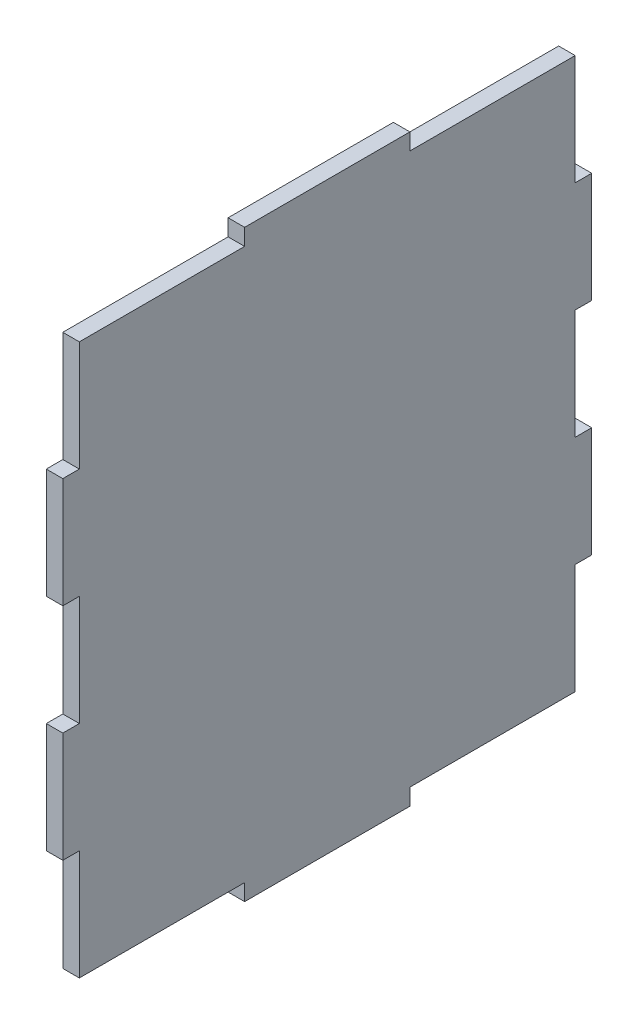
ISO-10303-21;
HEADER;
FILE_DESCRIPTION(('STEP AP214'),'2;1');
FILE_NAME('part.step','',(''),(''),'','','');
FILE_SCHEMA(('AUTOMOTIVE_DESIGN { 1 0 10303 214 1 1 1 1 }'));
ENDSEC;
DATA;
#1=APPLICATION_CONTEXT('core data for automotive mechanical design processes');
#2=APPLICATION_PROTOCOL_DEFINITION('international standard','automotive_design',2000,#1);
#3=PRODUCT_CONTEXT('',#1,'mechanical');
#4=PRODUCT('Part','Part','',(#3));
#5=PRODUCT_RELATED_PRODUCT_CATEGORY('part','',(#4));
#6=PRODUCT_DEFINITION_FORMATION('','',#4);
#7=PRODUCT_DEFINITION_CONTEXT('part definition',#1,'design');
#8=PRODUCT_DEFINITION('design','',#6,#7);
#9=PRODUCT_DEFINITION_SHAPE('','',#8);
#10=(LENGTH_UNIT() NAMED_UNIT(*) SI_UNIT(.MILLI.,.METRE.));
#11=(NAMED_UNIT(*) PLANE_ANGLE_UNIT() SI_UNIT($,.RADIAN.));
#12=(NAMED_UNIT(*) SI_UNIT($,.STERADIAN.) SOLID_ANGLE_UNIT());
#13=UNCERTAINTY_MEASURE_WITH_UNIT(LENGTH_MEASURE(1.E-05),#10,'distance_accuracy_value','');
#14=(GEOMETRIC_REPRESENTATION_CONTEXT(3) GLOBAL_UNCERTAINTY_ASSIGNED_CONTEXT((#13)) GLOBAL_UNIT_ASSIGNED_CONTEXT((#10,
#11,#12)) REPRESENTATION_CONTEXT('',''));
#15=CARTESIAN_POINT('',(0.,0.,0.));
#16=DIRECTION('',(0.,0.,1.));
#17=DIRECTION('',(1.,0.,0.));
#18=AXIS2_PLACEMENT_3D('',#15,#16,#17);
#19=CARTESIAN_POINT('',(3.,51.6037735849056,26.4150943396226));
#20=DIRECTION('',(0.,0.,-1.));
#21=DIRECTION('',(0.,1.,0.));
#22=AXIS2_PLACEMENT_3D('',#19,#20,#21);
#23=PLANE('',#22);
#24=DIRECTION('',(0.,-1.,0.));
#25=VECTOR('',#24,1.);
#26=CARTESIAN_POINT('',(0.,51.6037735849056,26.4150943396226));
#27=LINE('',#26,#25);
#28=CARTESIAN_POINT('',(0.,51.6037735849056,26.4150943396226));
#29=VERTEX_POINT('',#28);
#30=CARTESIAN_POINT('',(0.,31.6037735849056,26.4150943396228));
#31=VERTEX_POINT('',#30);
#32=EDGE_CURVE('E249',#29,#31,#27,.T.);
#33=ORIENTED_EDGE('',*,*,#32,.T.);
#34=DIRECTION('',(-1.,0.,0.));
#35=VECTOR('',#34,1.);
#36=CARTESIAN_POINT('',(3.,31.6037735849056,26.4150943396228));
#37=LINE('',#36,#35);
#38=CARTESIAN_POINT('',(3.,31.6037735849056,26.4150943396228));
#39=VERTEX_POINT('',#38);
#40=EDGE_CURVE('E11',#39,#31,#37,.T.);
#41=ORIENTED_EDGE('',*,*,#40,.F.);
#42=DIRECTION('',(0.,-1.,0.));
#43=VECTOR('',#42,1.);
#44=CARTESIAN_POINT('',(3.,51.6037735849056,26.4150943396226));
#45=LINE('',#44,#43);
#46=CARTESIAN_POINT('',(3.,51.6037735849056,26.4150943396226));
#47=VERTEX_POINT('',#46);
#48=EDGE_CURVE('E303',#47,#39,#45,.T.);
#49=ORIENTED_EDGE('',*,*,#48,.F.);
#50=DIRECTION('',(-1.,0.,0.));
#51=VECTOR('',#50,1.);
#52=CARTESIAN_POINT('',(3.,51.6037735849056,26.4150943396226));
#53=LINE('',#52,#51);
#54=EDGE_CURVE('E245',#47,#29,#53,.T.);
#55=ORIENTED_EDGE('',*,*,#54,.T.);
#56=EDGE_LOOP('',(#33,#41,#49,#55));
#57=FACE_BOUND('',#56,.T.);
#58=ADVANCED_FACE('F33',(#57),#23,.F.);
#59=CARTESIAN_POINT('',(3.,31.6037735849056,26.4150943396228));
#60=DIRECTION('',(0.,-1.,0.));
#61=DIRECTION('',(0.,0.,-1.));
#62=AXIS2_PLACEMENT_3D('',#59,#60,#61);
#63=PLANE('',#62);
#64=DIRECTION('',(0.,0.,1.));
#65=VECTOR('',#64,1.);
#66=CARTESIAN_POINT('',(0.,31.6037735849056,26.4150943396228));
#67=LINE('',#66,#65);
#68=CARTESIAN_POINT('',(0.,31.6037735849056,29.4150943396228));
#69=VERTEX_POINT('',#68);
#70=EDGE_CURVE('E252',#31,#69,#67,.T.);
#71=ORIENTED_EDGE('',*,*,#70,.T.);
#72=DIRECTION('',(-1.,0.,0.));
#73=VECTOR('',#72,1.);
#74=CARTESIAN_POINT('',(3.,31.6037735849056,29.4150943396228));
#75=LINE('',#74,#73);
#76=CARTESIAN_POINT('',(3.,31.6037735849056,29.4150943396228));
#77=VERTEX_POINT('',#76);
#78=EDGE_CURVE('E41',#77,#69,#75,.T.);
#79=ORIENTED_EDGE('',*,*,#78,.F.);
#80=DIRECTION('',(0.,0.,1.));
#81=VECTOR('',#80,1.);
#82=CARTESIAN_POINT('',(3.,31.6037735849056,26.4150943396228));
#83=LINE('',#82,#81);
#84=EDGE_CURVE('E152',#39,#77,#83,.T.);
#85=ORIENTED_EDGE('',*,*,#84,.F.);
#86=ORIENTED_EDGE('',*,*,#40,.T.);
#87=EDGE_LOOP('',(#71,#79,#85,#86));
#88=FACE_BOUND('',#87,.T.);
#89=ADVANCED_FACE('F461',(#88),#63,.F.);
#90=CARTESIAN_POINT('',(3.,11.6037735849056,29.4150943396228));
#91=DIRECTION('',(0.,0.,-1.));
#92=DIRECTION('',(0.,1.,0.));
#93=AXIS2_PLACEMENT_3D('',#90,#91,#92);
#94=PLANE('',#93);
#95=DIRECTION('',(0.,-1.,0.));
#96=VECTOR('',#95,1.);
#97=CARTESIAN_POINT('',(0.,11.6037735849056,29.4150943396228));
#98=LINE('',#97,#96);
#99=CARTESIAN_POINT('',(0.,11.6037735849056,29.4150943396228));
#100=VERTEX_POINT('',#99);
#101=EDGE_CURVE('E254',#69,#100,#98,.T.);
#102=ORIENTED_EDGE('',*,*,#101,.T.);
#103=DIRECTION('',(-1.,0.,0.));
#104=VECTOR('',#103,1.);
#105=CARTESIAN_POINT('',(3.,11.6037735849056,29.4150943396228));
#106=LINE('',#105,#104);
#107=CARTESIAN_POINT('',(3.,11.6037735849056,29.4150943396228));
#108=VERTEX_POINT('',#107);
#109=EDGE_CURVE('E370',#108,#100,#106,.T.);
#110=ORIENTED_EDGE('',*,*,#109,.F.);
#111=DIRECTION('',(0.,-1.,0.));
#112=VECTOR('',#111,1.);
#113=CARTESIAN_POINT('',(3.,11.6037735849056,29.4150943396228));
#114=LINE('',#113,#112);
#115=EDGE_CURVE('E378',#77,#108,#114,.T.);
#116=ORIENTED_EDGE('',*,*,#115,.F.);
#117=ORIENTED_EDGE('',*,*,#78,.T.);
#118=EDGE_LOOP('',(#102,#110,#116,#117));
#119=FACE_BOUND('',#118,.T.);
#120=ADVANCED_FACE('F376',(#119),#94,.F.);
#121=CARTESIAN_POINT('',(3.,11.6037735849056,26.4150943396228));
#122=DIRECTION('',(0.,1.,0.));
#123=DIRECTION('',(0.,0.,1.));
#124=AXIS2_PLACEMENT_3D('',#121,#122,#123);
#125=PLANE('',#124);
#126=DIRECTION('',(0.,0.,-1.));
#127=VECTOR('',#126,1.);
#128=CARTESIAN_POINT('',(0.,11.6037735849056,26.4150943396228));
#129=LINE('',#128,#127);
#130=CARTESIAN_POINT('',(0.,11.6037735849056,26.4150943396228));
#131=VERTEX_POINT('',#130);
#132=EDGE_CURVE('E256',#100,#131,#129,.T.);
#133=ORIENTED_EDGE('',*,*,#132,.T.);
#134=DIRECTION('',(-1.,0.,0.));
#135=VECTOR('',#134,1.);
#136=CARTESIAN_POINT('',(3.,11.6037735849056,26.4150943396228));
#137=LINE('',#136,#135);
#138=CARTESIAN_POINT('',(3.,11.6037735849056,26.4150943396228));
#139=VERTEX_POINT('',#138);
#140=EDGE_CURVE('E367',#139,#131,#137,.T.);
#141=ORIENTED_EDGE('',*,*,#140,.F.);
#142=DIRECTION('',(0.,0.,-1.));
#143=VECTOR('',#142,1.);
#144=CARTESIAN_POINT('',(3.,11.6037735849056,26.4150943396228));
#145=LINE('',#144,#143);
#146=EDGE_CURVE('E396',#108,#139,#145,.T.);
#147=ORIENTED_EDGE('',*,*,#146,.F.);
#148=ORIENTED_EDGE('',*,*,#109,.T.);
#149=EDGE_LOOP('',(#133,#141,#147,#148));
#150=FACE_BOUND('',#149,.T.);
#151=ADVANCED_FACE('F387',(#150),#125,.F.);
#152=CARTESIAN_POINT('',(3.,11.6037735849056,26.4150943396228));
#153=DIRECTION('',(0.,0.,-1.));
#154=DIRECTION('',(0.,1.,0.));
#155=AXIS2_PLACEMENT_3D('',#152,#153,#154);
#156=PLANE('',#155);
#157=DIRECTION('',(0.,-1.,0.));
#158=VECTOR('',#157,1.);
#159=CARTESIAN_POINT('',(0.,11.6037735849056,26.4150943396228));
#160=LINE('',#159,#158);
#161=CARTESIAN_POINT('',(0.,-8.39622641509436,26.4150943396226));
#162=VERTEX_POINT('',#161);
#163=EDGE_CURVE('E258',#131,#162,#160,.T.);
#164=ORIENTED_EDGE('',*,*,#163,.T.);
#165=DIRECTION('',(-1.,0.,0.));
#166=VECTOR('',#165,1.);
#167=CARTESIAN_POINT('',(3.,-8.39622641509436,26.4150943396226));
#168=LINE('',#167,#166);
#169=CARTESIAN_POINT('',(3.,-8.39622641509436,26.4150943396226));
#170=VERTEX_POINT('',#169);
#171=EDGE_CURVE('E364',#170,#162,#168,.T.);
#172=ORIENTED_EDGE('',*,*,#171,.F.);
#173=DIRECTION('',(0.,-1.,0.));
#174=VECTOR('',#173,1.);
#175=CARTESIAN_POINT('',(3.,11.6037735849056,26.4150943396228));
#176=LINE('',#175,#174);
#177=EDGE_CURVE('E393',#139,#170,#176,.T.);
#178=ORIENTED_EDGE('',*,*,#177,.F.);
#179=ORIENTED_EDGE('',*,*,#140,.T.);
#180=EDGE_LOOP('',(#164,#172,#178,#179));
#181=FACE_BOUND('',#180,.T.);
#182=ADVANCED_FACE('F391',(#181),#156,.F.);
#183=CARTESIAN_POINT('',(3.,-8.39622641509436,26.4150943396226));
#184=DIRECTION('',(0.,-1.,0.));
#185=DIRECTION('',(0.,0.,-1.));
#186=AXIS2_PLACEMENT_3D('',#183,#184,#185);
#187=PLANE('',#186);
#188=DIRECTION('',(0.,0.,1.));
#189=VECTOR('',#188,1.);
#190=CARTESIAN_POINT('',(0.,-8.39622641509436,26.4150943396226));
#191=LINE('',#190,#189);
#192=CARTESIAN_POINT('',(0.,-8.39622641509436,29.4150943396226));
#193=VERTEX_POINT('',#192);
#194=EDGE_CURVE('E260',#162,#193,#191,.T.);
#195=ORIENTED_EDGE('',*,*,#194,.T.);
#196=DIRECTION('',(-1.,0.,0.));
#197=VECTOR('',#196,1.);
#198=CARTESIAN_POINT('',(3.,-8.39622641509436,29.4150943396226));
#199=LINE('',#198,#197);
#200=CARTESIAN_POINT('',(3.,-8.39622641509436,29.4150943396226));
#201=VERTEX_POINT('',#200);
#202=EDGE_CURVE('E361',#201,#193,#199,.T.);
#203=ORIENTED_EDGE('',*,*,#202,.F.);
#204=DIRECTION('',(0.,0.,1.));
#205=VECTOR('',#204,1.);
#206=CARTESIAN_POINT('',(3.,-8.39622641509436,26.4150943396226));
#207=LINE('',#206,#205);
#208=EDGE_CURVE('E395',#170,#201,#207,.T.);
#209=ORIENTED_EDGE('',*,*,#208,.F.);
#210=ORIENTED_EDGE('',*,*,#171,.T.);
#211=EDGE_LOOP('',(#195,#203,#209,#210));
#212=FACE_BOUND('',#211,.T.);
#213=ADVANCED_FACE('F474',(#212),#187,.F.);
#214=CARTESIAN_POINT('',(3.,-28.3962264150944,29.4150943396226));
#215=DIRECTION('',(0.,0.,-1.));
#216=DIRECTION('',(0.,1.,0.));
#217=AXIS2_PLACEMENT_3D('',#214,#215,#216);
#218=PLANE('',#217);
#219=DIRECTION('',(0.,-1.,0.));
#220=VECTOR('',#219,1.);
#221=CARTESIAN_POINT('',(0.,-28.3962264150944,29.4150943396226));
#222=LINE('',#221,#220);
#223=CARTESIAN_POINT('',(0.,-28.3962264150944,29.4150943396226));
#224=VERTEX_POINT('',#223);
#225=EDGE_CURVE('E262',#193,#224,#222,.T.);
#226=ORIENTED_EDGE('',*,*,#225,.T.);
#227=DIRECTION('',(-1.,0.,0.));
#228=VECTOR('',#227,1.);
#229=CARTESIAN_POINT('',(3.,-28.3962264150944,29.4150943396226));
#230=LINE('',#229,#228);
#231=CARTESIAN_POINT('',(3.,-28.3962264150944,29.4150943396226));
#232=VERTEX_POINT('',#231);
#233=EDGE_CURVE('E358',#232,#224,#230,.T.);
#234=ORIENTED_EDGE('',*,*,#233,.F.);
#235=DIRECTION('',(0.,-1.,0.));
#236=VECTOR('',#235,1.);
#237=CARTESIAN_POINT('',(3.,-28.3962264150944,29.4150943396226));
#238=LINE('',#237,#236);
#239=EDGE_CURVE('E398',#201,#232,#238,.T.);
#240=ORIENTED_EDGE('',*,*,#239,.F.);
#241=ORIENTED_EDGE('',*,*,#202,.T.);
#242=EDGE_LOOP('',(#226,#234,#240,#241));
#243=FACE_BOUND('',#242,.T.);
#244=ADVANCED_FACE('F477',(#243),#218,.F.);
#245=CARTESIAN_POINT('',(3.,-28.3962264150944,26.4150943396226));
#246=DIRECTION('',(0.,1.,0.));
#247=DIRECTION('',(0.,0.,1.));
#248=AXIS2_PLACEMENT_3D('',#245,#246,#247);
#249=PLANE('',#248);
#250=DIRECTION('',(0.,0.,-1.));
#251=VECTOR('',#250,1.);
#252=CARTESIAN_POINT('',(0.,-28.3962264150944,26.4150943396226));
#253=LINE('',#252,#251);
#254=CARTESIAN_POINT('',(0.,-28.3962264150944,26.4150943396226));
#255=VERTEX_POINT('',#254);
#256=EDGE_CURVE('E264',#224,#255,#253,.T.);
#257=ORIENTED_EDGE('',*,*,#256,.T.);
#258=DIRECTION('',(-1.,0.,0.));
#259=VECTOR('',#258,1.);
#260=CARTESIAN_POINT('',(3.,-28.3962264150944,26.4150943396226));
#261=LINE('',#260,#259);
#262=CARTESIAN_POINT('',(3.,-28.3962264150944,26.4150943396226));
#263=VERTEX_POINT('',#262);
#264=EDGE_CURVE('E355',#263,#255,#261,.T.);
#265=ORIENTED_EDGE('',*,*,#264,.F.);
#266=DIRECTION('',(0.,0.,-1.));
#267=VECTOR('',#266,1.);
#268=CARTESIAN_POINT('',(3.,-28.3962264150944,26.4150943396226));
#269=LINE('',#268,#267);
#270=EDGE_CURVE('E404',#232,#263,#269,.T.);
#271=ORIENTED_EDGE('',*,*,#270,.F.);
#272=ORIENTED_EDGE('',*,*,#233,.T.);
#273=EDGE_LOOP('',(#257,#265,#271,#272));
#274=FACE_BOUND('',#273,.T.);
#275=ADVANCED_FACE('F481',(#274),#249,.F.);
#276=CARTESIAN_POINT('',(3.,-28.3962264150944,26.4150943396226));
#277=DIRECTION('',(0.,0.,-1.));
#278=DIRECTION('',(0.,1.,0.));
#279=AXIS2_PLACEMENT_3D('',#276,#277,#278);
#280=PLANE('',#279);
#281=DIRECTION('',(0.,-1.,0.));
#282=VECTOR('',#281,1.);
#283=CARTESIAN_POINT('',(0.,-28.3962264150944,26.4150943396226));
#284=LINE('',#283,#282);
#285=CARTESIAN_POINT('',(0.,-48.3962264150944,26.4150943396226));
#286=VERTEX_POINT('',#285);
#287=EDGE_CURVE('E266',#255,#286,#284,.T.);
#288=ORIENTED_EDGE('',*,*,#287,.T.);
#289=DIRECTION('',(-1.,0.,0.));
#290=VECTOR('',#289,1.);
#291=CARTESIAN_POINT('',(3.,-48.3962264150944,26.4150943396226));
#292=LINE('',#291,#290);
#293=CARTESIAN_POINT('',(3.,-48.3962264150944,26.4150943396226));
#294=VERTEX_POINT('',#293);
#295=EDGE_CURVE('E352',#294,#286,#292,.T.);
#296=ORIENTED_EDGE('',*,*,#295,.F.);
#297=DIRECTION('',(0.,-1.,0.));
#298=VECTOR('',#297,1.);
#299=CARTESIAN_POINT('',(3.,-28.3962264150944,26.4150943396226));
#300=LINE('',#299,#298);
#301=EDGE_CURVE('E406',#263,#294,#300,.T.);
#302=ORIENTED_EDGE('',*,*,#301,.F.);
#303=ORIENTED_EDGE('',*,*,#264,.T.);
#304=EDGE_LOOP('',(#288,#296,#302,#303));
#305=FACE_BOUND('',#304,.T.);
#306=ADVANCED_FACE('F485',(#305),#280,.F.);
#307=CARTESIAN_POINT('',(3.,-48.3962264150944,26.4150943396226));
#308=DIRECTION('',(0.,1.,0.));
#309=DIRECTION('',(0.,0.,1.));
#310=AXIS2_PLACEMENT_3D('',#307,#308,#309);
#311=PLANE('',#310);
#312=DIRECTION('',(0.,0.,-1.));
#313=VECTOR('',#312,1.);
#314=CARTESIAN_POINT('',(0.,-48.3962264150944,26.4150943396226));
#315=LINE('',#314,#313);
#316=CARTESIAN_POINT('',(0.,-48.3962264150944,-3.58490566037735));
#317=VERTEX_POINT('',#316);
#318=EDGE_CURVE('E268',#286,#317,#315,.T.);
#319=ORIENTED_EDGE('',*,*,#318,.T.);
#320=DIRECTION('',(-1.,0.,0.));
#321=VECTOR('',#320,1.);
#322=CARTESIAN_POINT('',(3.,-48.3962264150944,-3.58490566037735));
#323=LINE('',#322,#321);
#324=CARTESIAN_POINT('',(3.,-48.3962264150944,-3.58490566037735));
#325=VERTEX_POINT('',#324);
#326=EDGE_CURVE('E349',#325,#317,#323,.T.);
#327=ORIENTED_EDGE('',*,*,#326,.F.);
#328=DIRECTION('',(0.,0.,-1.));
#329=VECTOR('',#328,1.);
#330=CARTESIAN_POINT('',(3.,-48.3962264150944,26.4150943396226));
#331=LINE('',#330,#329);
#332=EDGE_CURVE('E408',#294,#325,#331,.T.);
#333=ORIENTED_EDGE('',*,*,#332,.F.);
#334=ORIENTED_EDGE('',*,*,#295,.T.);
#335=EDGE_LOOP('',(#319,#327,#333,#334));
#336=FACE_BOUND('',#335,.T.);
#337=ADVANCED_FACE('F489',(#336),#311,.F.);
#338=CARTESIAN_POINT('',(3.,-48.3962264150944,-3.58490566037735));
#339=DIRECTION('',(0.,0.,-1.));
#340=DIRECTION('',(0.,1.,0.));
#341=AXIS2_PLACEMENT_3D('',#338,#339,#340);
#342=PLANE('',#341);
#343=DIRECTION('',(0.,-1.,0.));
#344=VECTOR('',#343,1.);
#345=CARTESIAN_POINT('',(0.,-48.3962264150944,-3.58490566037735));
#346=LINE('',#345,#344);
#347=CARTESIAN_POINT('',(0.,-51.3962264150944,-3.58490566037735));
#348=VERTEX_POINT('',#347);
#349=EDGE_CURVE('E270',#317,#348,#346,.T.);
#350=ORIENTED_EDGE('',*,*,#349,.T.);
#351=DIRECTION('',(-1.,0.,0.));
#352=VECTOR('',#351,1.);
#353=CARTESIAN_POINT('',(3.,-51.3962264150944,-3.58490566037735));
#354=LINE('',#353,#352);
#355=CARTESIAN_POINT('',(3.,-51.3962264150944,-3.58490566037735));
#356=VERTEX_POINT('',#355);
#357=EDGE_CURVE('E346',#356,#348,#354,.T.);
#358=ORIENTED_EDGE('',*,*,#357,.F.);
#359=DIRECTION('',(0.,-1.,0.));
#360=VECTOR('',#359,1.);
#361=CARTESIAN_POINT('',(3.,-48.3962264150944,-3.58490566037735));
#362=LINE('',#361,#360);
#363=EDGE_CURVE('E410',#325,#356,#362,.T.);
#364=ORIENTED_EDGE('',*,*,#363,.F.);
#365=ORIENTED_EDGE('',*,*,#326,.T.);
#366=EDGE_LOOP('',(#350,#358,#364,#365));
#367=FACE_BOUND('',#366,.T.);
#368=ADVANCED_FACE('F493',(#367),#342,.F.);
#369=CARTESIAN_POINT('',(3.,-51.3962264150944,-33.5849056603773));
#370=DIRECTION('',(0.,1.,0.));
#371=DIRECTION('',(0.,0.,1.));
#372=AXIS2_PLACEMENT_3D('',#369,#370,#371);
#373=PLANE('',#372);
#374=DIRECTION('',(0.,0.,-1.));
#375=VECTOR('',#374,1.);
#376=CARTESIAN_POINT('',(0.,-51.3962264150944,-33.5849056603773));
#377=LINE('',#376,#375);
#378=CARTESIAN_POINT('',(0.,-51.3962264150944,-33.5849056603773));
#379=VERTEX_POINT('',#378);
#380=EDGE_CURVE('E272',#348,#379,#377,.T.);
#381=ORIENTED_EDGE('',*,*,#380,.T.);
#382=DIRECTION('',(-1.,0.,0.));
#383=VECTOR('',#382,1.);
#384=CARTESIAN_POINT('',(3.,-51.3962264150944,-33.5849056603773));
#385=LINE('',#384,#383);
#386=CARTESIAN_POINT('',(3.,-51.3962264150944,-33.5849056603773));
#387=VERTEX_POINT('',#386);
#388=EDGE_CURVE('E343',#387,#379,#385,.T.);
#389=ORIENTED_EDGE('',*,*,#388,.F.);
#390=DIRECTION('',(0.,0.,-1.));
#391=VECTOR('',#390,1.);
#392=CARTESIAN_POINT('',(3.,-51.3962264150944,-33.5849056603773));
#393=LINE('',#392,#391);
#394=EDGE_CURVE('E412',#356,#387,#393,.T.);
#395=ORIENTED_EDGE('',*,*,#394,.F.);
#396=ORIENTED_EDGE('',*,*,#357,.T.);
#397=EDGE_LOOP('',(#381,#389,#395,#396));
#398=FACE_BOUND('',#397,.T.);
#399=ADVANCED_FACE('F497',(#398),#373,.F.);
#400=CARTESIAN_POINT('',(3.,-48.3962264150944,-33.5849056603773));
#401=DIRECTION('',(0.,0.,1.));
#402=DIRECTION('',(1.,0.,0.));
#403=AXIS2_PLACEMENT_3D('',#400,#401,#402);
#404=PLANE('',#403);
#405=DIRECTION('',(0.,1.,0.));
#406=VECTOR('',#405,1.);
#407=CARTESIAN_POINT('',(0.,-48.3962264150944,-33.5849056603773));
#408=LINE('',#407,#406);
#409=CARTESIAN_POINT('',(0.,-48.3962264150944,-33.5849056603773));
#410=VERTEX_POINT('',#409);
#411=EDGE_CURVE('E274',#379,#410,#408,.T.);
#412=ORIENTED_EDGE('',*,*,#411,.T.);
#413=DIRECTION('',(-1.,0.,0.));
#414=VECTOR('',#413,1.);
#415=CARTESIAN_POINT('',(3.,-48.3962264150944,-33.5849056603773));
#416=LINE('',#415,#414);
#417=CARTESIAN_POINT('',(3.,-48.3962264150944,-33.5849056603773));
#418=VERTEX_POINT('',#417);
#419=EDGE_CURVE('E340',#418,#410,#416,.T.);
#420=ORIENTED_EDGE('',*,*,#419,.F.);
#421=DIRECTION('',(0.,1.,0.));
#422=VECTOR('',#421,1.);
#423=CARTESIAN_POINT('',(3.,-48.3962264150944,-33.5849056603773));
#424=LINE('',#423,#422);
#425=EDGE_CURVE('E414',#387,#418,#424,.T.);
#426=ORIENTED_EDGE('',*,*,#425,.F.);
#427=ORIENTED_EDGE('',*,*,#388,.T.);
#428=EDGE_LOOP('',(#412,#420,#426,#427));
#429=FACE_BOUND('',#428,.T.);
#430=ADVANCED_FACE('F501',(#429),#404,.F.);
#431=CARTESIAN_POINT('',(3.,-48.3962264150944,-33.5849056603773));
#432=DIRECTION('',(0.,1.,0.));
#433=DIRECTION('',(0.,0.,1.));
#434=AXIS2_PLACEMENT_3D('',#431,#432,#433);
#435=PLANE('',#434);
#436=DIRECTION('',(0.,0.,-1.));
#437=VECTOR('',#436,1.);
#438=CARTESIAN_POINT('',(0.,-48.3962264150944,-33.5849056603773));
#439=LINE('',#438,#437);
#440=CARTESIAN_POINT('',(0.,-48.3962264150944,-63.5849056603773));
#441=VERTEX_POINT('',#440);
#442=EDGE_CURVE('E276',#410,#441,#439,.T.);
#443=ORIENTED_EDGE('',*,*,#442,.T.);
#444=DIRECTION('',(-1.,0.,0.));
#445=VECTOR('',#444,1.);
#446=CARTESIAN_POINT('',(3.,-48.3962264150944,-63.5849056603773));
#447=LINE('',#446,#445);
#448=CARTESIAN_POINT('',(3.,-48.3962264150944,-63.5849056603773));
#449=VERTEX_POINT('',#448);
#450=EDGE_CURVE('E337',#449,#441,#447,.T.);
#451=ORIENTED_EDGE('',*,*,#450,.F.);
#452=DIRECTION('',(0.,0.,-1.));
#453=VECTOR('',#452,1.);
#454=CARTESIAN_POINT('',(3.,-48.3962264150944,-33.5849056603773));
#455=LINE('',#454,#453);
#456=EDGE_CURVE('E416',#418,#449,#455,.T.);
#457=ORIENTED_EDGE('',*,*,#456,.F.);
#458=ORIENTED_EDGE('',*,*,#419,.T.);
#459=EDGE_LOOP('',(#443,#451,#457,#458));
#460=FACE_BOUND('',#459,.T.);
#461=ADVANCED_FACE('F505',(#460),#435,.F.);
#462=CARTESIAN_POINT('',(3.,-28.3962264150944,-63.5849056603778));
#463=DIRECTION('',(0.,0.,1.));
#464=DIRECTION('',(0.,-1.,0.));
#465=AXIS2_PLACEMENT_3D('',#462,#463,#464);
#466=PLANE('',#465);
#467=DIRECTION('',(0.,1.,0.));
#468=VECTOR('',#467,1.);
#469=CARTESIAN_POINT('',(0.,-28.3962264150944,-63.5849056603778));
#470=LINE('',#469,#468);
#471=CARTESIAN_POINT('',(0.,-28.3962264150944,-63.5849056603778));
#472=VERTEX_POINT('',#471);
#473=EDGE_CURVE('E278',#441,#472,#470,.T.);
#474=ORIENTED_EDGE('',*,*,#473,.T.);
#475=DIRECTION('',(-1.,0.,0.));
#476=VECTOR('',#475,1.);
#477=CARTESIAN_POINT('',(3.,-28.3962264150944,-63.5849056603778));
#478=LINE('',#477,#476);
#479=CARTESIAN_POINT('',(3.,-28.3962264150944,-63.5849056603778));
#480=VERTEX_POINT('',#479);
#481=EDGE_CURVE('E334',#480,#472,#478,.T.);
#482=ORIENTED_EDGE('',*,*,#481,.F.);
#483=DIRECTION('',(0.,1.,0.));
#484=VECTOR('',#483,1.);
#485=CARTESIAN_POINT('',(3.,-28.3962264150944,-63.5849056603778));
#486=LINE('',#485,#484);
#487=EDGE_CURVE('E418',#449,#480,#486,.T.);
#488=ORIENTED_EDGE('',*,*,#487,.F.);
#489=ORIENTED_EDGE('',*,*,#450,.T.);
#490=EDGE_LOOP('',(#474,#482,#488,#489));
#491=FACE_BOUND('',#490,.T.);
#492=ADVANCED_FACE('F509',(#491),#466,.F.);
#493=CARTESIAN_POINT('',(3.,-28.3962264150944,-63.5849056603778));
#494=DIRECTION('',(0.,1.,0.));
#495=DIRECTION('',(0.,0.,1.));
#496=AXIS2_PLACEMENT_3D('',#493,#494,#495);
#497=PLANE('',#496);
#498=DIRECTION('',(0.,0.,-1.));
#499=VECTOR('',#498,1.);
#500=CARTESIAN_POINT('',(0.,-28.3962264150944,-63.5849056603778));
#501=LINE('',#500,#499);
#502=CARTESIAN_POINT('',(0.,-28.3962264150944,-66.5849056603778));
#503=VERTEX_POINT('',#502);
#504=EDGE_CURVE('E280',#472,#503,#501,.T.);
#505=ORIENTED_EDGE('',*,*,#504,.T.);
#506=DIRECTION('',(-1.,0.,0.));
#507=VECTOR('',#506,1.);
#508=CARTESIAN_POINT('',(3.,-28.3962264150944,-66.5849056603778));
#509=LINE('',#508,#507);
#510=CARTESIAN_POINT('',(3.,-28.3962264150944,-66.5849056603778));
#511=VERTEX_POINT('',#510);
#512=EDGE_CURVE('E331',#511,#503,#509,.T.);
#513=ORIENTED_EDGE('',*,*,#512,.F.);
#514=DIRECTION('',(0.,0.,-1.));
#515=VECTOR('',#514,1.);
#516=CARTESIAN_POINT('',(3.,-28.3962264150944,-63.5849056603778));
#517=LINE('',#516,#515);
#518=EDGE_CURVE('E420',#480,#511,#517,.T.);
#519=ORIENTED_EDGE('',*,*,#518,.F.);
#520=ORIENTED_EDGE('',*,*,#481,.T.);
#521=EDGE_LOOP('',(#505,#513,#519,#520));
#522=FACE_BOUND('',#521,.T.);
#523=ADVANCED_FACE('F513',(#522),#497,.F.);
#524=CARTESIAN_POINT('',(3.,-8.39622641509436,-66.5849056603778));
#525=DIRECTION('',(0.,0.,1.));
#526=DIRECTION('',(1.,0.,0.));
#527=AXIS2_PLACEMENT_3D('',#524,#525,#526);
#528=PLANE('',#527);
#529=DIRECTION('',(0.,1.,0.));
#530=VECTOR('',#529,1.);
#531=CARTESIAN_POINT('',(0.,-8.39622641509436,-66.5849056603778));
#532=LINE('',#531,#530);
#533=CARTESIAN_POINT('',(0.,-8.39622641509436,-66.5849056603778));
#534=VERTEX_POINT('',#533);
#535=EDGE_CURVE('E282',#503,#534,#532,.T.);
#536=ORIENTED_EDGE('',*,*,#535,.T.);
#537=DIRECTION('',(-1.,0.,0.));
#538=VECTOR('',#537,1.);
#539=CARTESIAN_POINT('',(3.,-8.39622641509436,-66.5849056603778));
#540=LINE('',#539,#538);
#541=CARTESIAN_POINT('',(3.,-8.39622641509436,-66.5849056603778));
#542=VERTEX_POINT('',#541);
#543=EDGE_CURVE('E328',#542,#534,#540,.T.);
#544=ORIENTED_EDGE('',*,*,#543,.F.);
#545=DIRECTION('',(0.,1.,0.));
#546=VECTOR('',#545,1.);
#547=CARTESIAN_POINT('',(3.,-8.39622641509436,-66.5849056603778));
#548=LINE('',#547,#546);
#549=EDGE_CURVE('E422',#511,#542,#548,.T.);
#550=ORIENTED_EDGE('',*,*,#549,.F.);
#551=ORIENTED_EDGE('',*,*,#512,.T.);
#552=EDGE_LOOP('',(#536,#544,#550,#551));
#553=FACE_BOUND('',#552,.T.);
#554=ADVANCED_FACE('F517',(#553),#528,.F.);
#555=CARTESIAN_POINT('',(3.,-8.39622641509436,-63.5849056603778));
#556=DIRECTION('',(0.,-1.,0.));
#557=DIRECTION('',(0.,0.,-1.));
#558=AXIS2_PLACEMENT_3D('',#555,#556,#557);
#559=PLANE('',#558);
#560=DIRECTION('',(0.,0.,1.));
#561=VECTOR('',#560,1.);
#562=CARTESIAN_POINT('',(0.,-8.39622641509436,-63.5849056603778));
#563=LINE('',#562,#561);
#564=CARTESIAN_POINT('',(0.,-8.39622641509436,-63.5849056603778));
#565=VERTEX_POINT('',#564);
#566=EDGE_CURVE('E284',#534,#565,#563,.T.);
#567=ORIENTED_EDGE('',*,*,#566,.T.);
#568=DIRECTION('',(-1.,0.,0.));
#569=VECTOR('',#568,1.);
#570=CARTESIAN_POINT('',(3.,-8.39622641509436,-63.5849056603778));
#571=LINE('',#570,#569);
#572=CARTESIAN_POINT('',(3.,-8.39622641509436,-63.5849056603778));
#573=VERTEX_POINT('',#572);
#574=EDGE_CURVE('E325',#573,#565,#571,.T.);
#575=ORIENTED_EDGE('',*,*,#574,.F.);
#576=DIRECTION('',(0.,0.,1.));
#577=VECTOR('',#576,1.);
#578=CARTESIAN_POINT('',(3.,-8.39622641509436,-63.5849056603778));
#579=LINE('',#578,#577);
#580=EDGE_CURVE('E424',#542,#573,#579,.T.);
#581=ORIENTED_EDGE('',*,*,#580,.F.);
#582=ORIENTED_EDGE('',*,*,#543,.T.);
#583=EDGE_LOOP('',(#567,#575,#581,#582));
#584=FACE_BOUND('',#583,.T.);
#585=ADVANCED_FACE('F521',(#584),#559,.F.);
#586=CARTESIAN_POINT('',(3.,11.6037735849056,-63.5849056603773));
#587=DIRECTION('',(0.,0.,1.));
#588=DIRECTION('',(0.,-1.,0.));
#589=AXIS2_PLACEMENT_3D('',#586,#587,#588);
#590=PLANE('',#589);
#591=DIRECTION('',(0.,1.,0.));
#592=VECTOR('',#591,1.);
#593=CARTESIAN_POINT('',(0.,11.6037735849056,-63.5849056603773));
#594=LINE('',#593,#592);
#595=CARTESIAN_POINT('',(0.,11.6037735849056,-63.5849056603773));
#596=VERTEX_POINT('',#595);
#597=EDGE_CURVE('E286',#565,#596,#594,.T.);
#598=ORIENTED_EDGE('',*,*,#597,.T.);
#599=DIRECTION('',(-1.,0.,0.));
#600=VECTOR('',#599,1.);
#601=CARTESIAN_POINT('',(3.,11.6037735849056,-63.5849056603773));
#602=LINE('',#601,#600);
#603=CARTESIAN_POINT('',(3.,11.6037735849056,-63.5849056603773));
#604=VERTEX_POINT('',#603);
#605=EDGE_CURVE('E322',#604,#596,#602,.T.);
#606=ORIENTED_EDGE('',*,*,#605,.F.);
#607=DIRECTION('',(0.,1.,0.));
#608=VECTOR('',#607,1.);
#609=CARTESIAN_POINT('',(3.,11.6037735849056,-63.5849056603773));
#610=LINE('',#609,#608);
#611=EDGE_CURVE('E426',#573,#604,#610,.T.);
#612=ORIENTED_EDGE('',*,*,#611,.F.);
#613=ORIENTED_EDGE('',*,*,#574,.T.);
#614=EDGE_LOOP('',(#598,#606,#612,#613));
#615=FACE_BOUND('',#614,.T.);
#616=ADVANCED_FACE('F525',(#615),#590,.F.);
#617=CARTESIAN_POINT('',(3.,11.6037735849056,-63.5849056603773));
#618=DIRECTION('',(0.,1.,0.));
#619=DIRECTION('',(0.,0.,1.));
#620=AXIS2_PLACEMENT_3D('',#617,#618,#619);
#621=PLANE('',#620);
#622=DIRECTION('',(0.,0.,-1.));
#623=VECTOR('',#622,1.);
#624=CARTESIAN_POINT('',(0.,11.6037735849056,-63.5849056603773));
#625=LINE('',#624,#623);
#626=CARTESIAN_POINT('',(0.,11.6037735849056,-66.5849056603773));
#627=VERTEX_POINT('',#626);
#628=EDGE_CURVE('E288',#596,#627,#625,.T.);
#629=ORIENTED_EDGE('',*,*,#628,.T.);
#630=DIRECTION('',(-1.,0.,0.));
#631=VECTOR('',#630,1.);
#632=CARTESIAN_POINT('',(3.,11.6037735849056,-66.5849056603773));
#633=LINE('',#632,#631);
#634=CARTESIAN_POINT('',(3.,11.6037735849056,-66.5849056603773));
#635=VERTEX_POINT('',#634);
#636=EDGE_CURVE('E319',#635,#627,#633,.T.);
#637=ORIENTED_EDGE('',*,*,#636,.F.);
#638=DIRECTION('',(0.,0.,-1.));
#639=VECTOR('',#638,1.);
#640=CARTESIAN_POINT('',(3.,11.6037735849056,-63.5849056603773));
#641=LINE('',#640,#639);
#642=EDGE_CURVE('E428',#604,#635,#641,.T.);
#643=ORIENTED_EDGE('',*,*,#642,.F.);
#644=ORIENTED_EDGE('',*,*,#605,.T.);
#645=EDGE_LOOP('',(#629,#637,#643,#644));
#646=FACE_BOUND('',#645,.T.);
#647=ADVANCED_FACE('F529',(#646),#621,.F.);
#648=CARTESIAN_POINT('',(3.,31.6037735849056,-66.5849056603773));
#649=DIRECTION('',(0.,0.,1.));
#650=DIRECTION('',(1.,0.,0.));
#651=AXIS2_PLACEMENT_3D('',#648,#649,#650);
#652=PLANE('',#651);
#653=DIRECTION('',(0.,1.,0.));
#654=VECTOR('',#653,1.);
#655=CARTESIAN_POINT('',(0.,31.6037735849056,-66.5849056603773));
#656=LINE('',#655,#654);
#657=CARTESIAN_POINT('',(0.,31.6037735849056,-66.5849056603773));
#658=VERTEX_POINT('',#657);
#659=EDGE_CURVE('E290',#627,#658,#656,.T.);
#660=ORIENTED_EDGE('',*,*,#659,.T.);
#661=DIRECTION('',(-1.,0.,0.));
#662=VECTOR('',#661,1.);
#663=CARTESIAN_POINT('',(3.,31.6037735849056,-66.5849056603773));
#664=LINE('',#663,#662);
#665=CARTESIAN_POINT('',(3.,31.6037735849056,-66.5849056603773));
#666=VERTEX_POINT('',#665);
#667=EDGE_CURVE('E316',#666,#658,#664,.T.);
#668=ORIENTED_EDGE('',*,*,#667,.F.);
#669=DIRECTION('',(0.,1.,0.));
#670=VECTOR('',#669,1.);
#671=CARTESIAN_POINT('',(3.,31.6037735849056,-66.5849056603773));
#672=LINE('',#671,#670);
#673=EDGE_CURVE('E430',#635,#666,#672,.T.);
#674=ORIENTED_EDGE('',*,*,#673,.F.);
#675=ORIENTED_EDGE('',*,*,#636,.T.);
#676=EDGE_LOOP('',(#660,#668,#674,#675));
#677=FACE_BOUND('',#676,.T.);
#678=ADVANCED_FACE('F533',(#677),#652,.F.);
#679=CARTESIAN_POINT('',(3.,31.6037735849056,-63.5849056603773));
#680=DIRECTION('',(0.,-1.,0.));
#681=DIRECTION('',(0.,0.,-1.));
#682=AXIS2_PLACEMENT_3D('',#679,#680,#681);
#683=PLANE('',#682);
#684=DIRECTION('',(0.,0.,1.));
#685=VECTOR('',#684,1.);
#686=CARTESIAN_POINT('',(0.,31.6037735849056,-63.5849056603773));
#687=LINE('',#686,#685);
#688=CARTESIAN_POINT('',(0.,31.6037735849056,-63.5849056603773));
#689=VERTEX_POINT('',#688);
#690=EDGE_CURVE('E292',#658,#689,#687,.T.);
#691=ORIENTED_EDGE('',*,*,#690,.T.);
#692=DIRECTION('',(-1.,0.,0.));
#693=VECTOR('',#692,1.);
#694=CARTESIAN_POINT('',(3.,31.6037735849056,-63.5849056603773));
#695=LINE('',#694,#693);
#696=CARTESIAN_POINT('',(3.,31.6037735849056,-63.5849056603773));
#697=VERTEX_POINT('',#696);
#698=EDGE_CURVE('E313',#697,#689,#695,.T.);
#699=ORIENTED_EDGE('',*,*,#698,.F.);
#700=DIRECTION('',(0.,0.,1.));
#701=VECTOR('',#700,1.);
#702=CARTESIAN_POINT('',(3.,31.6037735849056,-63.5849056603773));
#703=LINE('',#702,#701);
#704=EDGE_CURVE('E432',#666,#697,#703,.T.);
#705=ORIENTED_EDGE('',*,*,#704,.F.);
#706=ORIENTED_EDGE('',*,*,#667,.T.);
#707=EDGE_LOOP('',(#691,#699,#705,#706));
#708=FACE_BOUND('',#707,.T.);
#709=ADVANCED_FACE('F537',(#708),#683,.F.);
#710=CARTESIAN_POINT('',(3.,51.6037735849056,-63.5849056603773));
#711=DIRECTION('',(0.,0.,1.));
#712=DIRECTION('',(1.,0.,0.));
#713=AXIS2_PLACEMENT_3D('',#710,#711,#712);
#714=PLANE('',#713);
#715=DIRECTION('',(0.,1.,0.));
#716=VECTOR('',#715,1.);
#717=CARTESIAN_POINT('',(0.,51.6037735849056,-63.5849056603773));
#718=LINE('',#717,#716);
#719=CARTESIAN_POINT('',(0.,51.6037735849056,-63.5849056603773));
#720=VERTEX_POINT('',#719);
#721=EDGE_CURVE('E294',#689,#720,#718,.T.);
#722=ORIENTED_EDGE('',*,*,#721,.T.);
#723=DIRECTION('',(-1.,0.,0.));
#724=VECTOR('',#723,1.);
#725=CARTESIAN_POINT('',(3.,51.6037735849056,-63.5849056603773));
#726=LINE('',#725,#724);
#727=CARTESIAN_POINT('',(3.,51.6037735849056,-63.5849056603773));
#728=VERTEX_POINT('',#727);
#729=EDGE_CURVE('E310',#728,#720,#726,.T.);
#730=ORIENTED_EDGE('',*,*,#729,.F.);
#731=DIRECTION('',(0.,1.,0.));
#732=VECTOR('',#731,1.);
#733=CARTESIAN_POINT('',(3.,51.6037735849056,-63.5849056603773));
#734=LINE('',#733,#732);
#735=EDGE_CURVE('E434',#697,#728,#734,.T.);
#736=ORIENTED_EDGE('',*,*,#735,.F.);
#737=ORIENTED_EDGE('',*,*,#698,.T.);
#738=EDGE_LOOP('',(#722,#730,#736,#737));
#739=FACE_BOUND('',#738,.T.);
#740=ADVANCED_FACE('F541',(#739),#714,.F.);
#741=CARTESIAN_POINT('',(3.,51.6037735849056,-33.5849056603773));
#742=DIRECTION('',(0.,-1.,0.));
#743=DIRECTION('',(0.,0.,-1.));
#744=AXIS2_PLACEMENT_3D('',#741,#742,#743);
#745=PLANE('',#744);
#746=DIRECTION('',(0.,0.,1.));
#747=VECTOR('',#746,1.);
#748=CARTESIAN_POINT('',(0.,51.6037735849056,-33.5849056603773));
#749=LINE('',#748,#747);
#750=CARTESIAN_POINT('',(0.,51.6037735849056,-33.5849056603773));
#751=VERTEX_POINT('',#750);
#752=EDGE_CURVE('E296',#720,#751,#749,.T.);
#753=ORIENTED_EDGE('',*,*,#752,.T.);
#754=DIRECTION('',(-1.,0.,0.));
#755=VECTOR('',#754,1.);
#756=CARTESIAN_POINT('',(3.,51.6037735849056,-33.5849056603773));
#757=LINE('',#756,#755);
#758=CARTESIAN_POINT('',(3.,51.6037735849056,-33.5849056603773));
#759=VERTEX_POINT('',#758);
#760=EDGE_CURVE('E307',#759,#751,#757,.T.);
#761=ORIENTED_EDGE('',*,*,#760,.F.);
#762=DIRECTION('',(0.,0.,1.));
#763=VECTOR('',#762,1.);
#764=CARTESIAN_POINT('',(3.,51.6037735849056,-33.5849056603773));
#765=LINE('',#764,#763);
#766=EDGE_CURVE('E436',#728,#759,#765,.T.);
#767=ORIENTED_EDGE('',*,*,#766,.F.);
#768=ORIENTED_EDGE('',*,*,#729,.T.);
#769=EDGE_LOOP('',(#753,#761,#767,#768));
#770=FACE_BOUND('',#769,.T.);
#771=ADVANCED_FACE('F442',(#770),#745,.F.);
#772=CARTESIAN_POINT('',(3.,51.6037735849056,-33.5849056603773));
#773=DIRECTION('',(0.,0.,1.));
#774=DIRECTION('',(1.,0.,0.));
#775=AXIS2_PLACEMENT_3D('',#772,#773,#774);
#776=PLANE('',#775);
#777=DIRECTION('',(0.,1.,0.));
#778=VECTOR('',#777,1.);
#779=CARTESIAN_POINT('',(0.,51.6037735849056,-33.5849056603773));
#780=LINE('',#779,#778);
#781=CARTESIAN_POINT('',(0.,54.6037735849056,-33.5849056603773));
#782=VERTEX_POINT('',#781);
#783=EDGE_CURVE('E298',#751,#782,#780,.T.);
#784=ORIENTED_EDGE('',*,*,#783,.T.);
#785=DIRECTION('',(-1.,0.,0.));
#786=VECTOR('',#785,1.);
#787=CARTESIAN_POINT('',(3.,54.6037735849056,-33.5849056603773));
#788=LINE('',#787,#786);
#789=CARTESIAN_POINT('',(3.,54.6037735849056,-33.5849056603773));
#790=VERTEX_POINT('',#789);
#791=EDGE_CURVE('E240',#790,#782,#788,.T.);
#792=ORIENTED_EDGE('',*,*,#791,.F.);
#793=DIRECTION('',(0.,1.,0.));
#794=VECTOR('',#793,1.);
#795=CARTESIAN_POINT('',(3.,51.6037735849056,-33.5849056603773));
#796=LINE('',#795,#794);
#797=EDGE_CURVE('E231',#759,#790,#796,.T.);
#798=ORIENTED_EDGE('',*,*,#797,.F.);
#799=ORIENTED_EDGE('',*,*,#760,.T.);
#800=EDGE_LOOP('',(#784,#792,#798,#799));
#801=FACE_BOUND('',#800,.T.);
#802=ADVANCED_FACE('F446',(#801),#776,.F.);
#803=CARTESIAN_POINT('',(3.,54.6037735849056,-3.58490566037735));
#804=DIRECTION('',(0.,-1.,0.));
#805=DIRECTION('',(0.,0.,-1.));
#806=AXIS2_PLACEMENT_3D('',#803,#804,#805);
#807=PLANE('',#806);
#808=DIRECTION('',(0.,0.,1.));
#809=VECTOR('',#808,1.);
#810=CARTESIAN_POINT('',(0.,54.6037735849056,-3.58490566037735));
#811=LINE('',#810,#809);
#812=CARTESIAN_POINT('',(0.,54.6037735849056,-3.58490566037735));
#813=VERTEX_POINT('',#812);
#814=EDGE_CURVE('E239',#782,#813,#811,.T.);
#815=ORIENTED_EDGE('',*,*,#814,.T.);
#816=DIRECTION('',(-1.,0.,0.));
#817=VECTOR('',#816,1.);
#818=CARTESIAN_POINT('',(3.,54.6037735849056,-3.58490566037735));
#819=LINE('',#818,#817);
#820=CARTESIAN_POINT('',(3.,54.6037735849056,-3.58490566037735));
#821=VERTEX_POINT('',#820);
#822=EDGE_CURVE('E236',#821,#813,#819,.T.);
#823=ORIENTED_EDGE('',*,*,#822,.F.);
#824=DIRECTION('',(0.,0.,1.));
#825=VECTOR('',#824,1.);
#826=CARTESIAN_POINT('',(3.,54.6037735849056,-3.58490566037735));
#827=LINE('',#826,#825);
#828=EDGE_CURVE('E225',#790,#821,#827,.T.);
#829=ORIENTED_EDGE('',*,*,#828,.F.);
#830=ORIENTED_EDGE('',*,*,#791,.T.);
#831=EDGE_LOOP('',(#815,#823,#829,#830));
#832=FACE_BOUND('',#831,.T.);
#833=ADVANCED_FACE('F237',(#832),#807,.F.);
#834=CARTESIAN_POINT('',(3.,51.6037735849056,-3.58490566037735));
#835=DIRECTION('',(0.,0.,-1.));
#836=DIRECTION('',(-1.,0.,0.));
#837=AXIS2_PLACEMENT_3D('',#834,#835,#836);
#838=PLANE('',#837);
#839=DIRECTION('',(0.,-1.,0.));
#840=VECTOR('',#839,1.);
#841=CARTESIAN_POINT('',(0.,51.6037735849056,-3.58490566037735));
#842=LINE('',#841,#840);
#843=CARTESIAN_POINT('',(0.,51.6037735849056,-3.58490566037735));
#844=VERTEX_POINT('',#843);
#845=EDGE_CURVE('E138',#813,#844,#842,.T.);
#846=ORIENTED_EDGE('',*,*,#845,.T.);
#847=DIRECTION('',(-1.,0.,0.));
#848=VECTOR('',#847,1.);
#849=CARTESIAN_POINT('',(3.,51.6037735849056,-3.58490566037735));
#850=LINE('',#849,#848);
#851=CARTESIAN_POINT('',(3.,51.6037735849056,-3.58490566037735));
#852=VERTEX_POINT('',#851);
#853=EDGE_CURVE('E241',#852,#844,#850,.T.);
#854=ORIENTED_EDGE('',*,*,#853,.F.);
#855=DIRECTION('',(0.,-1.,0.));
#856=VECTOR('',#855,1.);
#857=CARTESIAN_POINT('',(3.,51.6037735849056,-3.58490566037735));
#858=LINE('',#857,#856);
#859=EDGE_CURVE('E229',#821,#852,#858,.T.);
#860=ORIENTED_EDGE('',*,*,#859,.F.);
#861=ORIENTED_EDGE('',*,*,#822,.T.);
#862=EDGE_LOOP('',(#846,#854,#860,#861));
#863=FACE_BOUND('',#862,.T.);
#864=ADVANCED_FACE('F243',(#863),#838,.F.);
#865=CARTESIAN_POINT('',(3.,51.6037735849056,26.4150943396226));
#866=DIRECTION('',(0.,-1.,0.));
#867=DIRECTION('',(0.,0.,-1.));
#868=AXIS2_PLACEMENT_3D('',#865,#866,#867);
#869=PLANE('',#868);
#870=DIRECTION('',(0.,0.,1.));
#871=VECTOR('',#870,1.);
#872=CARTESIAN_POINT('',(0.,51.6037735849056,26.4150943396226));
#873=LINE('',#872,#871);
#874=EDGE_CURVE('E144',#844,#29,#873,.T.);
#875=ORIENTED_EDGE('',*,*,#874,.T.);
#876=ORIENTED_EDGE('',*,*,#54,.F.);
#877=DIRECTION('',(0.,0.,1.));
#878=VECTOR('',#877,1.);
#879=CARTESIAN_POINT('',(3.,51.6037735849056,26.4150943396226));
#880=LINE('',#879,#878);
#881=EDGE_CURVE('E49',#852,#47,#880,.T.);
#882=ORIENTED_EDGE('',*,*,#881,.F.);
#883=ORIENTED_EDGE('',*,*,#853,.T.);
#884=EDGE_LOOP('',(#875,#876,#882,#883));
#885=FACE_BOUND('',#884,.T.);
#886=ADVANCED_FACE('F450',(#885),#869,.F.);
#887=CARTESIAN_POINT('',(3.,0.,0.));
#888=DIRECTION('',(-1.,0.,0.));
#889=DIRECTION('',(0.,0.,1.));
#890=AXIS2_PLACEMENT_3D('',#887,#888,#889);
#891=PLANE('',#890);
#892=ORIENTED_EDGE('',*,*,#48,.T.);
#893=ORIENTED_EDGE('',*,*,#84,.T.);
#894=ORIENTED_EDGE('',*,*,#115,.T.);
#895=ORIENTED_EDGE('',*,*,#146,.T.);
#896=ORIENTED_EDGE('',*,*,#177,.T.);
#897=ORIENTED_EDGE('',*,*,#208,.T.);
#898=ORIENTED_EDGE('',*,*,#239,.T.);
#899=ORIENTED_EDGE('',*,*,#270,.T.);
#900=ORIENTED_EDGE('',*,*,#301,.T.);
#901=ORIENTED_EDGE('',*,*,#332,.T.);
#902=ORIENTED_EDGE('',*,*,#363,.T.);
#903=ORIENTED_EDGE('',*,*,#394,.T.);
#904=ORIENTED_EDGE('',*,*,#425,.T.);
#905=ORIENTED_EDGE('',*,*,#456,.T.);
#906=ORIENTED_EDGE('',*,*,#487,.T.);
#907=ORIENTED_EDGE('',*,*,#518,.T.);
#908=ORIENTED_EDGE('',*,*,#549,.T.);
#909=ORIENTED_EDGE('',*,*,#580,.T.);
#910=ORIENTED_EDGE('',*,*,#611,.T.);
#911=ORIENTED_EDGE('',*,*,#642,.T.);
#912=ORIENTED_EDGE('',*,*,#673,.T.);
#913=ORIENTED_EDGE('',*,*,#704,.T.);
#914=ORIENTED_EDGE('',*,*,#735,.T.);
#915=ORIENTED_EDGE('',*,*,#766,.T.);
#916=ORIENTED_EDGE('',*,*,#797,.T.);
#917=ORIENTED_EDGE('',*,*,#828,.T.);
#918=ORIENTED_EDGE('',*,*,#859,.T.);
#919=ORIENTED_EDGE('',*,*,#881,.T.);
#920=EDGE_LOOP('',(#892,#893,#894,#895,#896,#897,#898,#899,#900,#901,#902,#903,#904,#905,#906,
#907,#908,#909,#910,#911,#912,#913,#914,#915,#916,#917,#918,#919));
#921=FACE_BOUND('',#920,.T.);
#922=ADVANCED_FACE('F227',(#921),#891,.F.);
#923=CARTESIAN_POINT('',(0.,0.,0.));
#924=DIRECTION('',(-1.,0.,0.));
#925=DIRECTION('',(0.,0.,1.));
#926=AXIS2_PLACEMENT_3D('',#923,#924,#925);
#927=PLANE('',#926);
#928=ORIENTED_EDGE('',*,*,#32,.F.);
#929=ORIENTED_EDGE('',*,*,#874,.F.);
#930=ORIENTED_EDGE('',*,*,#845,.F.);
#931=ORIENTED_EDGE('',*,*,#814,.F.);
#932=ORIENTED_EDGE('',*,*,#783,.F.);
#933=ORIENTED_EDGE('',*,*,#752,.F.);
#934=ORIENTED_EDGE('',*,*,#721,.F.);
#935=ORIENTED_EDGE('',*,*,#690,.F.);
#936=ORIENTED_EDGE('',*,*,#659,.F.);
#937=ORIENTED_EDGE('',*,*,#628,.F.);
#938=ORIENTED_EDGE('',*,*,#597,.F.);
#939=ORIENTED_EDGE('',*,*,#566,.F.);
#940=ORIENTED_EDGE('',*,*,#535,.F.);
#941=ORIENTED_EDGE('',*,*,#504,.F.);
#942=ORIENTED_EDGE('',*,*,#473,.F.);
#943=ORIENTED_EDGE('',*,*,#442,.F.);
#944=ORIENTED_EDGE('',*,*,#411,.F.);
#945=ORIENTED_EDGE('',*,*,#380,.F.);
#946=ORIENTED_EDGE('',*,*,#349,.F.);
#947=ORIENTED_EDGE('',*,*,#318,.F.);
#948=ORIENTED_EDGE('',*,*,#287,.F.);
#949=ORIENTED_EDGE('',*,*,#256,.F.);
#950=ORIENTED_EDGE('',*,*,#225,.F.);
#951=ORIENTED_EDGE('',*,*,#194,.F.);
#952=ORIENTED_EDGE('',*,*,#163,.F.);
#953=ORIENTED_EDGE('',*,*,#132,.F.);
#954=ORIENTED_EDGE('',*,*,#101,.F.);
#955=ORIENTED_EDGE('',*,*,#70,.F.);
#956=EDGE_LOOP('',(#928,#929,#930,#931,#932,#933,#934,#935,#936,#937,#938,#939,#940,#941,#942,
#943,#944,#945,#946,#947,#948,#949,#950,#951,#952,#953,#954,#955));
#957=FACE_BOUND('',#956,.T.);
#958=ADVANCED_FACE('F382',(#957),#927,.T.);
#959=CLOSED_SHELL('',(#58,#89,#120,#151,#182,#213,#244,#275,#306,#337,#368,#399,#430,#461,#492,
#523,#554,#585,#616,#647,#678,#709,#740,#771,#802,#833,#864,#886,#922,#958));
#960=MANIFOLD_SOLID_BREP('B2',#959);
#961=ADVANCED_BREP_SHAPE_REPRESENTATION('',(#18,#960),#14);
#962=SHAPE_DEFINITION_REPRESENTATION(#9,#961);
ENDSEC;
END-ISO-10303-21;
